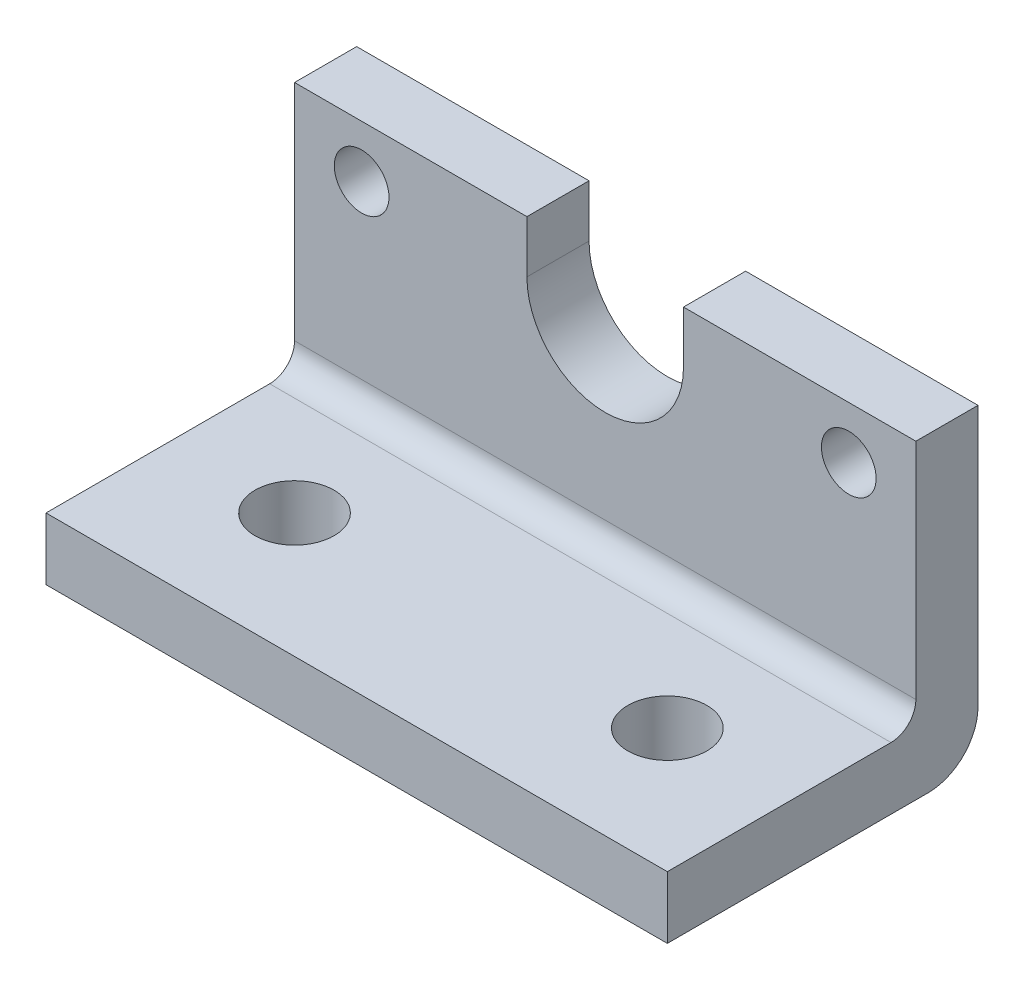
ISO-10303-21;
HEADER;
FILE_DESCRIPTION(('STEP AP214'),'2;1');
FILE_NAME('part.step','',(''),(''),'','','');
FILE_SCHEMA(('AUTOMOTIVE_DESIGN { 1 0 10303 214 1 1 1 1 }'));
ENDSEC;
DATA;
#1=APPLICATION_CONTEXT('core data for automotive mechanical design processes');
#2=APPLICATION_PROTOCOL_DEFINITION('international standard','automotive_design',2000,#1);
#3=PRODUCT_CONTEXT('',#1,'mechanical');
#4=PRODUCT('Part','Part','',(#3));
#5=PRODUCT_RELATED_PRODUCT_CATEGORY('part','',(#4));
#6=PRODUCT_DEFINITION_FORMATION('','',#4);
#7=PRODUCT_DEFINITION_CONTEXT('part definition',#1,'design');
#8=PRODUCT_DEFINITION('design','',#6,#7);
#9=PRODUCT_DEFINITION_SHAPE('','',#8);
#10=(LENGTH_UNIT() NAMED_UNIT(*) SI_UNIT(.MILLI.,.METRE.));
#11=(NAMED_UNIT(*) PLANE_ANGLE_UNIT() SI_UNIT($,.RADIAN.));
#12=(NAMED_UNIT(*) SI_UNIT($,.STERADIAN.) SOLID_ANGLE_UNIT());
#13=UNCERTAINTY_MEASURE_WITH_UNIT(LENGTH_MEASURE(1.E-05),#10,'distance_accuracy_value','');
#14=(GEOMETRIC_REPRESENTATION_CONTEXT(3) GLOBAL_UNCERTAINTY_ASSIGNED_CONTEXT((#13)) GLOBAL_UNIT_ASSIGNED_CONTEXT((#10,
#11,#12)) REPRESENTATION_CONTEXT('',''));
#15=CARTESIAN_POINT('',(0.,0.,0.));
#16=DIRECTION('',(0.,0.,1.));
#17=DIRECTION('',(1.,0.,0.));
#18=AXIS2_PLACEMENT_3D('',#15,#16,#17);
#19=CARTESIAN_POINT('',(15.875,15.875,-3.175));
#20=DIRECTION('',(1.,0.,0.));
#21=DIRECTION('',(0.,1.,0.));
#22=AXIS2_PLACEMENT_3D('',#19,#20,#21);
#23=PLANE('',#22);
#24=DIRECTION('',(0.,0.,1.));
#25=VECTOR('',#24,1.);
#26=CARTESIAN_POINT('',(15.875,0.,-3.175));
#27=LINE('',#26,#25);
#28=CARTESIAN_POINT('',(15.875,0.,-0.635));
#29=VERTEX_POINT('',#28);
#30=CARTESIAN_POINT('',(15.875,0.,12.7));
#31=VERTEX_POINT('',#30);
#32=EDGE_CURVE('E210',#29,#31,#27,.T.);
#33=ORIENTED_EDGE('',*,*,#32,.F.);
#34=CARTESIAN_POINT('',(15.875,2.54,-0.635));
#35=DIRECTION('',(1.,0.,0.));
#36=DIRECTION('',(0.,1.,0.));
#37=AXIS2_PLACEMENT_3D('',#34,#35,#36);
#38=CIRCLE('',#37,2.54);
#39=CARTESIAN_POINT('',(15.875,2.54,-3.175));
#40=VERTEX_POINT('',#39);
#41=EDGE_CURVE('E55',#29,#40,#38,.T.);
#42=ORIENTED_EDGE('',*,*,#41,.T.);
#43=DIRECTION('',(0.,1.,0.));
#44=VECTOR('',#43,1.);
#45=CARTESIAN_POINT('',(15.875,15.875,-3.175));
#46=LINE('',#45,#44);
#47=CARTESIAN_POINT('',(15.875,15.875,-3.175));
#48=VERTEX_POINT('',#47);
#49=EDGE_CURVE('E169',#40,#48,#46,.T.);
#50=ORIENTED_EDGE('',*,*,#49,.T.);
#51=DIRECTION('',(0.,0.,1.));
#52=VECTOR('',#51,1.);
#53=CARTESIAN_POINT('',(15.875,15.875,-3.175));
#54=LINE('',#53,#52);
#55=CARTESIAN_POINT('',(15.875,15.875,0.));
#56=VERTEX_POINT('',#55);
#57=EDGE_CURVE('E189',#48,#56,#54,.T.);
#58=ORIENTED_EDGE('',*,*,#57,.T.);
#59=DIRECTION('',(0.,1.,0.));
#60=VECTOR('',#59,1.);
#61=CARTESIAN_POINT('',(15.875,15.875,0.));
#62=LINE('',#61,#60);
#63=CARTESIAN_POINT('',(15.875,4.445,0.));
#64=VERTEX_POINT('',#63);
#65=EDGE_CURVE('E166',#64,#56,#62,.T.);
#66=ORIENTED_EDGE('',*,*,#65,.F.);
#67=CARTESIAN_POINT('',(15.875,4.445,1.27));
#68=DIRECTION('',(1.,0.,0.));
#69=DIRECTION('',(0.,1.,0.));
#70=AXIS2_PLACEMENT_3D('',#67,#68,#69);
#71=CIRCLE('',#70,1.27);
#72=CARTESIAN_POINT('',(15.875,3.175,1.27));
#73=VERTEX_POINT('',#72);
#74=EDGE_CURVE('E201',#64,#73,#71,.F.);
#75=ORIENTED_EDGE('',*,*,#74,.T.);
#76=DIRECTION('',(0.,0.,-1.));
#77=VECTOR('',#76,1.);
#78=CARTESIAN_POINT('',(15.875,3.175,12.7));
#79=LINE('',#78,#77);
#80=CARTESIAN_POINT('',(15.875,3.175,12.7));
#81=VERTEX_POINT('',#80);
#82=EDGE_CURVE('E132',#81,#73,#79,.T.);
#83=ORIENTED_EDGE('',*,*,#82,.F.);
#84=DIRECTION('',(0.,-1.,0.));
#85=VECTOR('',#84,1.);
#86=CARTESIAN_POINT('',(15.875,3.175,12.7));
#87=LINE('',#86,#85);
#88=EDGE_CURVE('E143',#81,#31,#87,.T.);
#89=ORIENTED_EDGE('',*,*,#88,.T.);
#90=EDGE_LOOP('',(#33,#42,#50,#58,#66,#75,#83,#89));
#91=FACE_BOUND('',#90,.T.);
#92=ADVANCED_FACE('F33',(#91),#23,.T.);
#93=CARTESIAN_POINT('',(-15.875,0.,-3.175));
#94=DIRECTION('',(0.,-1.,0.));
#95=DIRECTION('',(0.,0.,-1.));
#96=AXIS2_PLACEMENT_3D('',#93,#94,#95);
#97=PLANE('',#96);
#98=DIRECTION('',(0.,0.,1.));
#99=VECTOR('',#98,1.);
#100=CARTESIAN_POINT('',(-15.875,0.,-3.175));
#101=LINE('',#100,#99);
#102=CARTESIAN_POINT('',(-15.875,0.,-0.635));
#103=VERTEX_POINT('',#102);
#104=CARTESIAN_POINT('',(-15.875,0.,12.7));
#105=VERTEX_POINT('',#104);
#106=EDGE_CURVE('E138',#103,#105,#101,.T.);
#107=ORIENTED_EDGE('',*,*,#106,.F.);
#108=DIRECTION('',(1.,0.,0.));
#109=VECTOR('',#108,1.);
#110=CARTESIAN_POINT('',(15.875,0.,-0.635));
#111=LINE('',#110,#109);
#112=EDGE_CURVE('E203',#103,#29,#111,.T.);
#113=ORIENTED_EDGE('',*,*,#112,.T.);
#114=ORIENTED_EDGE('',*,*,#32,.T.);
#115=DIRECTION('',(1.,0.,0.));
#116=VECTOR('',#115,1.);
#117=CARTESIAN_POINT('',(-15.875,0.,12.7));
#118=LINE('',#117,#116);
#119=EDGE_CURVE('E154',#105,#31,#118,.T.);
#120=ORIENTED_EDGE('',*,*,#119,.F.);
#121=EDGE_LOOP('',(#107,#113,#114,#120));
#122=FACE_BOUND('',#121,.T.);
#123=CARTESIAN_POINT('',(-9.525,0.,6.35));
#124=DIRECTION('',(0.,1.,0.));
#125=DIRECTION('',(0.,0.,1.));
#126=AXIS2_PLACEMENT_3D('',#123,#124,#125);
#127=CIRCLE('',#126,2.0193);
#128=CARTESIAN_POINT('',(-9.525,0.,8.3693));
#129=VERTEX_POINT('',#128);
#130=EDGE_CURVE('E152',#129,#129,#127,.T.);
#131=ORIENTED_EDGE('',*,*,#130,.T.);
#132=EDGE_LOOP('',(#131));
#133=FACE_BOUND('',#132,.T.);
#134=CARTESIAN_POINT('',(9.525,0.,6.35));
#135=DIRECTION('',(0.,1.,0.));
#136=DIRECTION('',(0.,0.,1.));
#137=AXIS2_PLACEMENT_3D('',#134,#135,#136);
#138=CIRCLE('',#137,2.0193);
#139=CARTESIAN_POINT('',(9.525,0.,8.3693));
#140=VERTEX_POINT('',#139);
#141=EDGE_CURVE('E335',#140,#140,#138,.T.);
#142=ORIENTED_EDGE('',*,*,#141,.T.);
#143=EDGE_LOOP('',(#142));
#144=FACE_BOUND('',#143,.T.);
#145=ADVANCED_FACE('F208',(#122,#133,#144),#97,.T.);
#146=CARTESIAN_POINT('',(-15.875,15.875,-3.175));
#147=DIRECTION('',(-1.,0.,0.));
#148=DIRECTION('',(0.,-1.,0.));
#149=AXIS2_PLACEMENT_3D('',#146,#147,#148);
#150=PLANE('',#149);
#151=DIRECTION('',(0.,-1.,0.));
#152=VECTOR('',#151,1.);
#153=CARTESIAN_POINT('',(-15.875,15.875,-3.175));
#154=LINE('',#153,#152);
#155=CARTESIAN_POINT('',(-15.875,15.875,-3.175));
#156=VERTEX_POINT('',#155);
#157=CARTESIAN_POINT('',(-15.875,2.54,-3.175));
#158=VERTEX_POINT('',#157);
#159=EDGE_CURVE('E187',#156,#158,#154,.T.);
#160=ORIENTED_EDGE('',*,*,#159,.T.);
#161=CARTESIAN_POINT('',(-15.875,2.54,-0.635));
#162=DIRECTION('',(-1.,0.,0.));
#163=DIRECTION('',(0.,-1.,0.));
#164=AXIS2_PLACEMENT_3D('',#161,#162,#163);
#165=CIRCLE('',#164,2.54);
#166=EDGE_CURVE('E11',#158,#103,#165,.T.);
#167=ORIENTED_EDGE('',*,*,#166,.T.);
#168=ORIENTED_EDGE('',*,*,#106,.T.);
#169=DIRECTION('',(0.,-1.,0.));
#170=VECTOR('',#169,1.);
#171=CARTESIAN_POINT('',(-15.875,3.175,12.7));
#172=LINE('',#171,#170);
#173=CARTESIAN_POINT('',(-15.875,3.175,12.7));
#174=VERTEX_POINT('',#173);
#175=EDGE_CURVE('E135',#174,#105,#172,.T.);
#176=ORIENTED_EDGE('',*,*,#175,.F.);
#177=DIRECTION('',(0.,0.,1.));
#178=VECTOR('',#177,1.);
#179=CARTESIAN_POINT('',(-15.875,3.175,12.7));
#180=LINE('',#179,#178);
#181=CARTESIAN_POINT('',(-15.875,3.175,1.27));
#182=VERTEX_POINT('',#181);
#183=EDGE_CURVE('E121',#182,#174,#180,.T.);
#184=ORIENTED_EDGE('',*,*,#183,.F.);
#185=CARTESIAN_POINT('',(-15.875,4.445,1.27));
#186=DIRECTION('',(-1.,0.,0.));
#187=DIRECTION('',(0.,-1.,0.));
#188=AXIS2_PLACEMENT_3D('',#185,#186,#187);
#189=CIRCLE('',#188,1.27);
#190=CARTESIAN_POINT('',(-15.875,4.445,0.));
#191=VERTEX_POINT('',#190);
#192=EDGE_CURVE('E199',#182,#191,#189,.F.);
#193=ORIENTED_EDGE('',*,*,#192,.T.);
#194=DIRECTION('',(0.,-1.,0.));
#195=VECTOR('',#194,1.);
#196=CARTESIAN_POINT('',(-15.875,15.875,0.));
#197=LINE('',#196,#195);
#198=CARTESIAN_POINT('',(-15.875,15.875,0.));
#199=VERTEX_POINT('',#198);
#200=EDGE_CURVE('E172',#199,#191,#197,.T.);
#201=ORIENTED_EDGE('',*,*,#200,.F.);
#202=DIRECTION('',(0.,0.,1.));
#203=VECTOR('',#202,1.);
#204=CARTESIAN_POINT('',(-15.875,15.875,-3.175));
#205=LINE('',#204,#203);
#206=EDGE_CURVE('E214',#156,#199,#205,.T.);
#207=ORIENTED_EDGE('',*,*,#206,.F.);
#208=EDGE_LOOP('',(#160,#167,#168,#176,#184,#193,#201,#207));
#209=FACE_BOUND('',#208,.T.);
#210=ADVANCED_FACE('F136',(#209),#150,.T.);
#211=CARTESIAN_POINT('',(-15.875,15.875,-3.175));
#212=DIRECTION('',(0.,1.,0.));
#213=DIRECTION('',(0.,0.,1.));
#214=AXIS2_PLACEMENT_3D('',#211,#212,#213);
#215=PLANE('',#214);
#216=DIRECTION('',(-1.,0.,0.));
#217=VECTOR('',#216,1.);
#218=CARTESIAN_POINT('',(-15.875,15.875,0.));
#219=LINE('',#218,#217);
#220=CARTESIAN_POINT('',(-4.0005,15.875,0.));
#221=VERTEX_POINT('',#220);
#222=EDGE_CURVE('E233',#221,#199,#219,.T.);
#223=ORIENTED_EDGE('',*,*,#222,.F.);
#224=DIRECTION('',(0.,0.,1.));
#225=VECTOR('',#224,1.);
#226=CARTESIAN_POINT('',(-4.0005,15.875,-3.175));
#227=LINE('',#226,#225);
#228=CARTESIAN_POINT('',(-4.0005,15.875,-3.175));
#229=VERTEX_POINT('',#228);
#230=EDGE_CURVE('E221',#229,#221,#227,.T.);
#231=ORIENTED_EDGE('',*,*,#230,.F.);
#232=DIRECTION('',(-1.,0.,0.));
#233=VECTOR('',#232,1.);
#234=CARTESIAN_POINT('',(-15.875,15.875,-3.175));
#235=LINE('',#234,#233);
#236=EDGE_CURVE('E184',#229,#156,#235,.T.);
#237=ORIENTED_EDGE('',*,*,#236,.T.);
#238=ORIENTED_EDGE('',*,*,#206,.T.);
#239=EDGE_LOOP('',(#223,#231,#237,#238));
#240=FACE_BOUND('',#239,.T.);
#241=ADVANCED_FACE('F277',(#240),#215,.T.);
#242=CARTESIAN_POINT('',(-4.0005,13.208,-3.175));
#243=DIRECTION('',(1.,0.,0.));
#244=DIRECTION('',(0.,1.,0.));
#245=AXIS2_PLACEMENT_3D('',#242,#243,#244);
#246=PLANE('',#245);
#247=DIRECTION('',(0.,1.,0.));
#248=VECTOR('',#247,1.);
#249=CARTESIAN_POINT('',(-4.0005,13.208,0.));
#250=LINE('',#249,#248);
#251=CARTESIAN_POINT('',(-4.0005,13.208,0.));
#252=VERTEX_POINT('',#251);
#253=EDGE_CURVE('E252',#252,#221,#250,.T.);
#254=ORIENTED_EDGE('',*,*,#253,.F.);
#255=DIRECTION('',(0.,0.,1.));
#256=VECTOR('',#255,1.);
#257=CARTESIAN_POINT('',(-4.0005,13.208,-3.175));
#258=LINE('',#257,#256);
#259=CARTESIAN_POINT('',(-4.0005,13.208,-3.175));
#260=VERTEX_POINT('',#259);
#261=EDGE_CURVE('E223',#260,#252,#258,.T.);
#262=ORIENTED_EDGE('',*,*,#261,.F.);
#263=DIRECTION('',(0.,1.,0.));
#264=VECTOR('',#263,1.);
#265=CARTESIAN_POINT('',(-4.0005,13.208,-3.175));
#266=LINE('',#265,#264);
#267=EDGE_CURVE('E181',#260,#229,#266,.T.);
#268=ORIENTED_EDGE('',*,*,#267,.T.);
#269=ORIENTED_EDGE('',*,*,#230,.T.);
#270=EDGE_LOOP('',(#254,#262,#268,#269));
#271=FACE_BOUND('',#270,.T.);
#272=ADVANCED_FACE('F275',(#271),#246,.T.);
#273=CARTESIAN_POINT('',(0.,13.208,-3.175));
#274=DIRECTION('',(0.,0.,1.));
#275=DIRECTION('',(1.,0.,0.));
#276=AXIS2_PLACEMENT_3D('',#273,#274,#275);
#277=CYLINDRICAL_SURFACE('',#276,4.0005);
#278=CARTESIAN_POINT('',(0.,13.208,0.));
#279=DIRECTION('',(0.,0.,-1.));
#280=DIRECTION('',(1.,0.,0.));
#281=AXIS2_PLACEMENT_3D('',#278,#279,#280);
#282=CIRCLE('',#281,4.0005);
#283=CARTESIAN_POINT('',(4.0005,13.208,0.));
#284=VERTEX_POINT('',#283);
#285=EDGE_CURVE('E254',#284,#252,#282,.T.);
#286=ORIENTED_EDGE('',*,*,#285,.F.);
#287=DIRECTION('',(0.,0.,1.));
#288=VECTOR('',#287,1.);
#289=CARTESIAN_POINT('',(4.0005,13.208,-3.175));
#290=LINE('',#289,#288);
#291=CARTESIAN_POINT('',(4.0005,13.208,-3.175));
#292=VERTEX_POINT('',#291);
#293=EDGE_CURVE('E225',#292,#284,#290,.T.);
#294=ORIENTED_EDGE('',*,*,#293,.F.);
#295=CARTESIAN_POINT('',(0.,13.208,-3.175));
#296=DIRECTION('',(0.,0.,-1.));
#297=DIRECTION('',(1.,0.,0.));
#298=AXIS2_PLACEMENT_3D('',#295,#296,#297);
#299=CIRCLE('',#298,4.0005);
#300=EDGE_CURVE('E178',#292,#260,#299,.T.);
#301=ORIENTED_EDGE('',*,*,#300,.T.);
#302=ORIENTED_EDGE('',*,*,#261,.T.);
#303=EDGE_LOOP('',(#286,#294,#301,#302));
#304=FACE_BOUND('',#303,.T.);
#305=ADVANCED_FACE('F272',(#304),#277,.F.);
#306=CARTESIAN_POINT('',(4.0005,13.208,-3.175));
#307=DIRECTION('',(-1.,0.,0.));
#308=DIRECTION('',(0.,-1.,0.));
#309=AXIS2_PLACEMENT_3D('',#306,#307,#308);
#310=PLANE('',#309);
#311=DIRECTION('',(0.,-1.,0.));
#312=VECTOR('',#311,1.);
#313=CARTESIAN_POINT('',(4.0005,13.208,0.));
#314=LINE('',#313,#312);
#315=CARTESIAN_POINT('',(4.0005,15.875,0.));
#316=VERTEX_POINT('',#315);
#317=EDGE_CURVE('E257',#316,#284,#314,.T.);
#318=ORIENTED_EDGE('',*,*,#317,.F.);
#319=DIRECTION('',(0.,0.,1.));
#320=VECTOR('',#319,1.);
#321=CARTESIAN_POINT('',(4.0005,15.875,-3.175));
#322=LINE('',#321,#320);
#323=CARTESIAN_POINT('',(4.0005,15.875,-3.175));
#324=VERTEX_POINT('',#323);
#325=EDGE_CURVE('E227',#324,#316,#322,.T.);
#326=ORIENTED_EDGE('',*,*,#325,.F.);
#327=DIRECTION('',(0.,-1.,0.));
#328=VECTOR('',#327,1.);
#329=CARTESIAN_POINT('',(4.0005,13.208,-3.175));
#330=LINE('',#329,#328);
#331=EDGE_CURVE('E175',#324,#292,#330,.T.);
#332=ORIENTED_EDGE('',*,*,#331,.T.);
#333=ORIENTED_EDGE('',*,*,#293,.T.);
#334=EDGE_LOOP('',(#318,#326,#332,#333));
#335=FACE_BOUND('',#334,.T.);
#336=ADVANCED_FACE('F268',(#335),#310,.T.);
#337=CARTESIAN_POINT('',(4.0005,15.875,-3.175));
#338=DIRECTION('',(0.,1.,0.));
#339=DIRECTION('',(0.,0.,1.));
#340=AXIS2_PLACEMENT_3D('',#337,#338,#339);
#341=PLANE('',#340);
#342=DIRECTION('',(-1.,0.,0.));
#343=VECTOR('',#342,1.);
#344=CARTESIAN_POINT('',(4.0005,15.875,0.));
#345=LINE('',#344,#343);
#346=EDGE_CURVE('E192',#56,#316,#345,.T.);
#347=ORIENTED_EDGE('',*,*,#346,.F.);
#348=ORIENTED_EDGE('',*,*,#57,.F.);
#349=DIRECTION('',(-1.,0.,0.));
#350=VECTOR('',#349,1.);
#351=CARTESIAN_POINT('',(4.0005,15.875,-3.175));
#352=LINE('',#351,#350);
#353=EDGE_CURVE('E171',#48,#324,#352,.T.);
#354=ORIENTED_EDGE('',*,*,#353,.T.);
#355=ORIENTED_EDGE('',*,*,#325,.T.);
#356=EDGE_LOOP('',(#347,#348,#354,#355));
#357=FACE_BOUND('',#356,.T.);
#358=ADVANCED_FACE('F264',(#357),#341,.T.);
#359=CARTESIAN_POINT('',(0.,13.208,-3.175));
#360=DIRECTION('',(0.,0.,1.));
#361=DIRECTION('',(1.,0.,0.));
#362=AXIS2_PLACEMENT_3D('',#359,#360,#361);
#363=PLANE('',#362);
#364=CARTESIAN_POINT('',(-12.446,13.208,-3.175));
#365=DIRECTION('',(0.,0.,1.));
#366=DIRECTION('',(1.,0.,0.));
#367=AXIS2_PLACEMENT_3D('',#364,#365,#366);
#368=CIRCLE('',#367,1.397);
#369=CARTESIAN_POINT('',(-11.049,13.208,-3.175));
#370=VERTEX_POINT('',#369);
#371=EDGE_CURVE('E157',#370,#370,#368,.T.);
#372=ORIENTED_EDGE('',*,*,#371,.T.);
#373=EDGE_LOOP('',(#372));
#374=FACE_BOUND('',#373,.T.);
#375=CARTESIAN_POINT('',(12.446,13.208,-3.175));
#376=DIRECTION('',(0.,0.,1.));
#377=DIRECTION('',(1.,0.,0.));
#378=AXIS2_PLACEMENT_3D('',#375,#376,#377);
#379=CIRCLE('',#378,1.397);
#380=CARTESIAN_POINT('',(13.843,13.208,-3.175));
#381=VERTEX_POINT('',#380);
#382=EDGE_CURVE('E163',#381,#381,#379,.T.);
#383=ORIENTED_EDGE('',*,*,#382,.T.);
#384=EDGE_LOOP('',(#383));
#385=FACE_BOUND('',#384,.T.);
#386=ORIENTED_EDGE('',*,*,#49,.F.);
#387=DIRECTION('',(1.,0.,0.));
#388=VECTOR('',#387,1.);
#389=CARTESIAN_POINT('',(-15.875,2.54,-3.175));
#390=LINE('',#389,#388);
#391=EDGE_CURVE('E41',#40,#158,#390,.F.);
#392=ORIENTED_EDGE('',*,*,#391,.T.);
#393=ORIENTED_EDGE('',*,*,#159,.F.);
#394=ORIENTED_EDGE('',*,*,#236,.F.);
#395=ORIENTED_EDGE('',*,*,#267,.F.);
#396=ORIENTED_EDGE('',*,*,#300,.F.);
#397=ORIENTED_EDGE('',*,*,#331,.F.);
#398=ORIENTED_EDGE('',*,*,#353,.F.);
#399=EDGE_LOOP('',(#386,#392,#393,#394,#395,#396,#397,#398));
#400=FACE_BOUND('',#399,.T.);
#401=ADVANCED_FACE('F278',(#374,#385,#400),#363,.F.);
#402=CARTESIAN_POINT('',(0.,13.208,0.));
#403=DIRECTION('',(0.,0.,1.));
#404=DIRECTION('',(1.,0.,0.));
#405=AXIS2_PLACEMENT_3D('',#402,#403,#404);
#406=PLANE('',#405);
#407=ORIENTED_EDGE('',*,*,#200,.T.);
#408=DIRECTION('',(-1.,0.,0.));
#409=VECTOR('',#408,1.);
#410=CARTESIAN_POINT('',(0.,4.445,0.));
#411=LINE('',#410,#409);
#412=EDGE_CURVE('E197',#191,#64,#411,.F.);
#413=ORIENTED_EDGE('',*,*,#412,.T.);
#414=ORIENTED_EDGE('',*,*,#65,.T.);
#415=ORIENTED_EDGE('',*,*,#346,.T.);
#416=ORIENTED_EDGE('',*,*,#317,.T.);
#417=ORIENTED_EDGE('',*,*,#285,.T.);
#418=ORIENTED_EDGE('',*,*,#253,.T.);
#419=ORIENTED_EDGE('',*,*,#222,.T.);
#420=EDGE_LOOP('',(#407,#413,#414,#415,#416,#417,#418,#419));
#421=FACE_BOUND('',#420,.T.);
#422=CARTESIAN_POINT('',(-12.446,13.208,0.));
#423=DIRECTION('',(0.,0.,1.));
#424=DIRECTION('',(1.,0.,0.));
#425=AXIS2_PLACEMENT_3D('',#422,#423,#424);
#426=CIRCLE('',#425,1.397);
#427=CARTESIAN_POINT('',(-11.049,13.208,0.));
#428=VERTEX_POINT('',#427);
#429=EDGE_CURVE('E142',#428,#428,#426,.T.);
#430=ORIENTED_EDGE('',*,*,#429,.F.);
#431=EDGE_LOOP('',(#430));
#432=FACE_BOUND('',#431,.T.);
#433=CARTESIAN_POINT('',(12.446,13.208,0.));
#434=DIRECTION('',(0.,0.,1.));
#435=DIRECTION('',(1.,0.,0.));
#436=AXIS2_PLACEMENT_3D('',#433,#434,#435);
#437=CIRCLE('',#436,1.397);
#438=CARTESIAN_POINT('',(13.843,13.208,0.));
#439=VERTEX_POINT('',#438);
#440=EDGE_CURVE('E160',#439,#439,#437,.T.);
#441=ORIENTED_EDGE('',*,*,#440,.F.);
#442=EDGE_LOOP('',(#441));
#443=FACE_BOUND('',#442,.T.);
#444=ADVANCED_FACE('F245',(#421,#432,#443),#406,.T.);
#445=CARTESIAN_POINT('',(12.446,13.208,-3.175));
#446=DIRECTION('',(0.,0.,1.));
#447=DIRECTION('',(1.,0.,0.));
#448=AXIS2_PLACEMENT_3D('',#445,#446,#447);
#449=CYLINDRICAL_SURFACE('',#448,1.397);
#450=ORIENTED_EDGE('',*,*,#382,.F.);
#451=EDGE_LOOP('',(#450));
#452=FACE_BOUND('',#451,.T.);
#453=ORIENTED_EDGE('',*,*,#440,.T.);
#454=EDGE_LOOP('',(#453));
#455=FACE_BOUND('',#454,.T.);
#456=ADVANCED_FACE('F305',(#452,#455),#449,.F.);
#457=CARTESIAN_POINT('',(-12.446,13.208,-3.175));
#458=DIRECTION('',(0.,0.,1.));
#459=DIRECTION('',(1.,0.,0.));
#460=AXIS2_PLACEMENT_3D('',#457,#458,#459);
#461=CYLINDRICAL_SURFACE('',#460,1.397);
#462=ORIENTED_EDGE('',*,*,#371,.F.);
#463=EDGE_LOOP('',(#462));
#464=FACE_BOUND('',#463,.T.);
#465=ORIENTED_EDGE('',*,*,#429,.T.);
#466=EDGE_LOOP('',(#465));
#467=FACE_BOUND('',#466,.T.);
#468=ADVANCED_FACE('F311',(#464,#467),#461,.F.);
#469=CARTESIAN_POINT('',(0.,3.175,0.));
#470=DIRECTION('',(0.,-1.,0.));
#471=DIRECTION('',(0.,0.,-1.));
#472=AXIS2_PLACEMENT_3D('',#469,#470,#471);
#473=PLANE('',#472);
#474=CARTESIAN_POINT('',(-9.525,3.175,6.35));
#475=DIRECTION('',(0.,1.,0.));
#476=DIRECTION('',(0.,0.,1.));
#477=AXIS2_PLACEMENT_3D('',#474,#475,#476);
#478=CIRCLE('',#477,2.0193);
#479=CARTESIAN_POINT('',(-9.525,3.175,8.3693));
#480=VERTEX_POINT('',#479);
#481=EDGE_CURVE('E155',#480,#480,#478,.T.);
#482=ORIENTED_EDGE('',*,*,#481,.F.);
#483=EDGE_LOOP('',(#482));
#484=FACE_BOUND('',#483,.T.);
#485=ORIENTED_EDGE('',*,*,#82,.T.);
#486=DIRECTION('',(-1.,0.,0.));
#487=VECTOR('',#486,1.);
#488=CARTESIAN_POINT('',(0.,3.175,1.27));
#489=LINE('',#488,#487);
#490=EDGE_CURVE('E130',#73,#182,#489,.T.);
#491=ORIENTED_EDGE('',*,*,#490,.T.);
#492=ORIENTED_EDGE('',*,*,#183,.T.);
#493=DIRECTION('',(1.,0.,0.));
#494=VECTOR('',#493,1.);
#495=CARTESIAN_POINT('',(-15.875,3.175,12.7));
#496=LINE('',#495,#494);
#497=EDGE_CURVE('E127',#174,#81,#496,.T.);
#498=ORIENTED_EDGE('',*,*,#497,.T.);
#499=EDGE_LOOP('',(#485,#491,#492,#498));
#500=FACE_BOUND('',#499,.T.);
#501=CARTESIAN_POINT('',(9.525,3.175,6.35));
#502=DIRECTION('',(0.,1.,0.));
#503=DIRECTION('',(0.,0.,1.));
#504=AXIS2_PLACEMENT_3D('',#501,#502,#503);
#505=CIRCLE('',#504,2.0193);
#506=CARTESIAN_POINT('',(9.525,3.175,8.3693));
#507=VERTEX_POINT('',#506);
#508=EDGE_CURVE('E332',#507,#507,#505,.T.);
#509=ORIENTED_EDGE('',*,*,#508,.F.);
#510=EDGE_LOOP('',(#509));
#511=FACE_BOUND('',#510,.T.);
#512=ADVANCED_FACE('F124',(#484,#500,#511),#473,.F.);
#513=CARTESIAN_POINT('',(-15.875,3.175,12.7));
#514=DIRECTION('',(0.,0.,-1.));
#515=DIRECTION('',(-1.,0.,0.));
#516=AXIS2_PLACEMENT_3D('',#513,#514,#515);
#517=PLANE('',#516);
#518=ORIENTED_EDGE('',*,*,#119,.T.);
#519=ORIENTED_EDGE('',*,*,#88,.F.);
#520=ORIENTED_EDGE('',*,*,#497,.F.);
#521=ORIENTED_EDGE('',*,*,#175,.T.);
#522=EDGE_LOOP('',(#518,#519,#520,#521));
#523=FACE_BOUND('',#522,.T.);
#524=ADVANCED_FACE('F145',(#523),#517,.F.);
#525=CARTESIAN_POINT('',(-9.525,3.175,6.35));
#526=DIRECTION('',(0.,-1.,0.));
#527=DIRECTION('',(0.,0.,-1.));
#528=AXIS2_PLACEMENT_3D('',#525,#526,#527);
#529=CYLINDRICAL_SURFACE('',#528,2.0193);
#530=ORIENTED_EDGE('',*,*,#481,.T.);
#531=EDGE_LOOP('',(#530));
#532=FACE_BOUND('',#531,.T.);
#533=ORIENTED_EDGE('',*,*,#130,.F.);
#534=EDGE_LOOP('',(#533));
#535=FACE_BOUND('',#534,.T.);
#536=ADVANCED_FACE('F318',(#532,#535),#529,.F.);
#537=CARTESIAN_POINT('',(9.525,3.175,6.35));
#538=DIRECTION('',(0.,-1.,0.));
#539=DIRECTION('',(0.,0.,-1.));
#540=AXIS2_PLACEMENT_3D('',#537,#538,#539);
#541=CYLINDRICAL_SURFACE('',#540,2.0193);
#542=ORIENTED_EDGE('',*,*,#508,.T.);
#543=EDGE_LOOP('',(#542));
#544=FACE_BOUND('',#543,.T.);
#545=ORIENTED_EDGE('',*,*,#141,.F.);
#546=EDGE_LOOP('',(#545));
#547=FACE_BOUND('',#546,.T.);
#548=ADVANCED_FACE('F283',(#544,#547),#541,.F.);
#549=CARTESIAN_POINT('',(0.,4.445,1.27));
#550=DIRECTION('',(-1.,0.,0.));
#551=DIRECTION('',(0.,0.,1.));
#552=AXIS2_PLACEMENT_3D('',#549,#550,#551);
#553=CYLINDRICAL_SURFACE('',#552,1.27);
#554=ORIENTED_EDGE('',*,*,#74,.F.);
#555=ORIENTED_EDGE('',*,*,#412,.F.);
#556=ORIENTED_EDGE('',*,*,#192,.F.);
#557=ORIENTED_EDGE('',*,*,#490,.F.);
#558=EDGE_LOOP('',(#554,#555,#556,#557));
#559=FACE_BOUND('',#558,.T.);
#560=ADVANCED_FACE('F240',(#559),#553,.F.);
#561=CARTESIAN_POINT('',(-15.875,2.54,-0.635));
#562=DIRECTION('',(-1.,0.,0.));
#563=DIRECTION('',(0.,0.,1.));
#564=AXIS2_PLACEMENT_3D('',#561,#562,#563);
#565=CYLINDRICAL_SURFACE('',#564,2.54);
#566=ORIENTED_EDGE('',*,*,#166,.F.);
#567=ORIENTED_EDGE('',*,*,#391,.F.);
#568=ORIENTED_EDGE('',*,*,#41,.F.);
#569=ORIENTED_EDGE('',*,*,#112,.F.);
#570=EDGE_LOOP('',(#566,#567,#568,#569));
#571=FACE_BOUND('',#570,.T.);
#572=ADVANCED_FACE('F35',(#571),#565,.T.);
#573=CLOSED_SHELL('',(#92,#145,#210,#241,#272,#305,#336,#358,#401,#444,#456,#468,#512,#524,#536,
#548,#560,#572));
#574=MANIFOLD_SOLID_BREP('B2',#573);
#575=ADVANCED_BREP_SHAPE_REPRESENTATION('',(#18,#574),#14);
#576=SHAPE_DEFINITION_REPRESENTATION(#9,#575);
ENDSEC;
END-ISO-10303-21;
